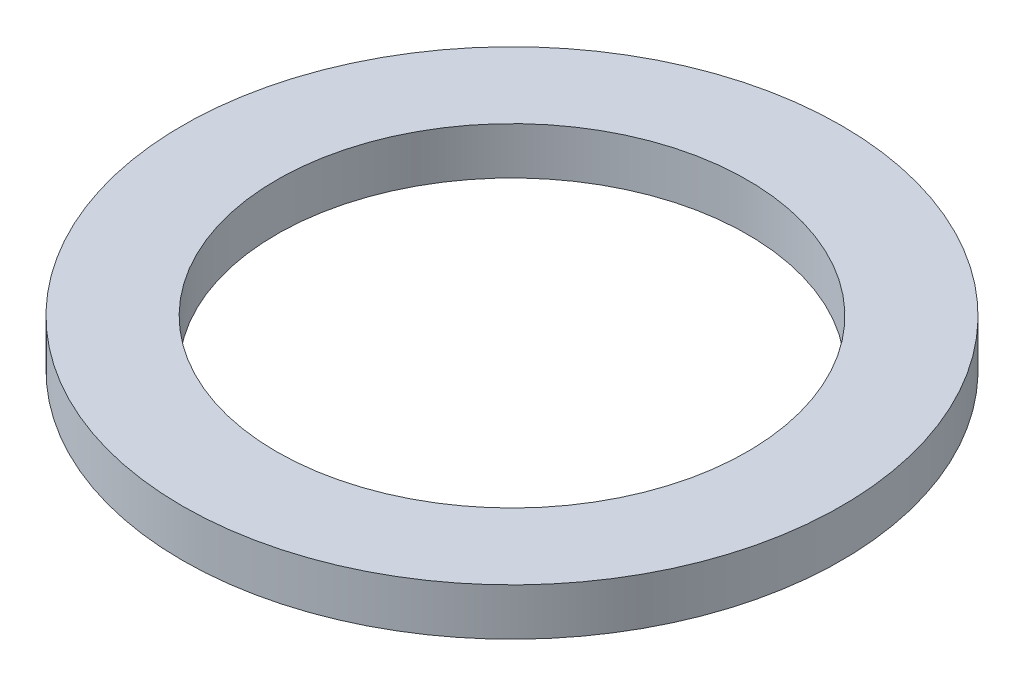
ISO-10303-21;
HEADER;
FILE_DESCRIPTION(('STEP AP214'),'2;1');
FILE_NAME('part.step','',(''),(''),'','','');
FILE_SCHEMA(('AUTOMOTIVE_DESIGN { 1 0 10303 214 1 1 1 1 }'));
ENDSEC;
DATA;
#1=APPLICATION_CONTEXT('core data for automotive mechanical design processes');
#2=APPLICATION_PROTOCOL_DEFINITION('international standard','automotive_design',2000,#1);
#3=PRODUCT_CONTEXT('',#1,'mechanical');
#4=PRODUCT('Part','Part','',(#3));
#5=PRODUCT_RELATED_PRODUCT_CATEGORY('part','',(#4));
#6=PRODUCT_DEFINITION_FORMATION('','',#4);
#7=PRODUCT_DEFINITION_CONTEXT('part definition',#1,'design');
#8=PRODUCT_DEFINITION('design','',#6,#7);
#9=PRODUCT_DEFINITION_SHAPE('','',#8);
#10=(LENGTH_UNIT() NAMED_UNIT(*) SI_UNIT(.MILLI.,.METRE.));
#11=(NAMED_UNIT(*) PLANE_ANGLE_UNIT() SI_UNIT($,.RADIAN.));
#12=(NAMED_UNIT(*) SI_UNIT($,.STERADIAN.) SOLID_ANGLE_UNIT());
#13=UNCERTAINTY_MEASURE_WITH_UNIT(LENGTH_MEASURE(1.E-05),#10,'distance_accuracy_value','');
#14=(GEOMETRIC_REPRESENTATION_CONTEXT(3) GLOBAL_UNCERTAINTY_ASSIGNED_CONTEXT((#13)) GLOBAL_UNIT_ASSIGNED_CONTEXT((#10,
#11,#12)) REPRESENTATION_CONTEXT('',''));
#15=CARTESIAN_POINT('',(0.,0.,0.));
#16=DIRECTION('',(0.,0.,1.));
#17=DIRECTION('',(1.,0.,0.));
#18=AXIS2_PLACEMENT_3D('',#15,#16,#17);
#19=CARTESIAN_POINT('',(0.,0.25,0.));
#20=DIRECTION('',(0.,1.,0.));
#21=DIRECTION('',(0.,0.,1.));
#22=AXIS2_PLACEMENT_3D('',#19,#20,#21);
#23=PLANE('',#22);
#24=CARTESIAN_POINT('',(0.,0.25,0.));
#25=DIRECTION('',(0.,1.,0.));
#26=DIRECTION('',(0.,0.,1.));
#27=AXIS2_PLACEMENT_3D('',#24,#25,#26);
#28=CIRCLE('',#27,3.5);
#29=CARTESIAN_POINT('',(0.,0.25,3.5));
#30=VERTEX_POINT('',#29);
#31=EDGE_CURVE('E10',#30,#30,#28,.T.);
#32=ORIENTED_EDGE('',*,*,#31,.T.);
#33=EDGE_LOOP('',(#32));
#34=FACE_BOUND('',#33,.T.);
#35=CARTESIAN_POINT('',(0.,0.25,0.));
#36=DIRECTION('',(0.,1.,0.));
#37=DIRECTION('',(0.,0.,1.));
#38=AXIS2_PLACEMENT_3D('',#35,#36,#37);
#39=CIRCLE('',#38,2.5);
#40=CARTESIAN_POINT('',(0.,0.25,2.5));
#41=VERTEX_POINT('',#40);
#42=EDGE_CURVE('E50',#41,#41,#39,.T.);
#43=ORIENTED_EDGE('',*,*,#42,.F.);
#44=EDGE_LOOP('',(#43));
#45=FACE_BOUND('',#44,.T.);
#46=ADVANCED_FACE('F39',(#34,#45),#23,.T.);
#47=CARTESIAN_POINT('',(0.,-0.25,0.));
#48=DIRECTION('',(0.,1.,0.));
#49=DIRECTION('',(0.,0.,1.));
#50=AXIS2_PLACEMENT_3D('',#47,#48,#49);
#51=PLANE('',#50);
#52=CARTESIAN_POINT('',(0.,-0.25,0.));
#53=DIRECTION('',(0.,1.,0.));
#54=DIRECTION('',(0.,0.,1.));
#55=AXIS2_PLACEMENT_3D('',#52,#53,#54);
#56=CIRCLE('',#55,3.5);
#57=CARTESIAN_POINT('',(0.,-0.25,3.5));
#58=VERTEX_POINT('',#57);
#59=EDGE_CURVE('E43',#58,#58,#56,.T.);
#60=ORIENTED_EDGE('',*,*,#59,.F.);
#61=EDGE_LOOP('',(#60));
#62=FACE_BOUND('',#61,.T.);
#63=CARTESIAN_POINT('',(0.,-0.25,0.));
#64=DIRECTION('',(0.,1.,0.));
#65=DIRECTION('',(0.,0.,1.));
#66=AXIS2_PLACEMENT_3D('',#63,#64,#65);
#67=CIRCLE('',#66,2.5);
#68=CARTESIAN_POINT('',(0.,-0.25,2.5));
#69=VERTEX_POINT('',#68);
#70=EDGE_CURVE('E52',#69,#69,#67,.T.);
#71=ORIENTED_EDGE('',*,*,#70,.T.);
#72=EDGE_LOOP('',(#71));
#73=FACE_BOUND('',#72,.T.);
#74=ADVANCED_FACE('F62',(#62,#73),#51,.F.);
#75=CARTESIAN_POINT('',(0.,0.25,0.));
#76=DIRECTION('',(0.,-1.,0.));
#77=DIRECTION('',(0.,0.,-1.));
#78=AXIS2_PLACEMENT_3D('',#75,#76,#77);
#79=CYLINDRICAL_SURFACE('',#78,3.5);
#80=ORIENTED_EDGE('',*,*,#31,.F.);
#81=EDGE_LOOP('',(#80));
#82=FACE_BOUND('',#81,.T.);
#83=ORIENTED_EDGE('',*,*,#59,.T.);
#84=EDGE_LOOP('',(#83));
#85=FACE_BOUND('',#84,.T.);
#86=ADVANCED_FACE('F41',(#82,#85),#79,.T.);
#87=CARTESIAN_POINT('',(0.,0.25,0.));
#88=DIRECTION('',(0.,-1.,0.));
#89=DIRECTION('',(0.,0.,-1.));
#90=AXIS2_PLACEMENT_3D('',#87,#88,#89);
#91=CYLINDRICAL_SURFACE('',#90,2.5);
#92=ORIENTED_EDGE('',*,*,#42,.T.);
#93=EDGE_LOOP('',(#92));
#94=FACE_BOUND('',#93,.T.);
#95=ORIENTED_EDGE('',*,*,#70,.F.);
#96=EDGE_LOOP('',(#95));
#97=FACE_BOUND('',#96,.T.);
#98=ADVANCED_FACE('F58',(#94,#97),#91,.F.);
#99=CLOSED_SHELL('',(#46,#74,#86,#98));
#100=MANIFOLD_SOLID_BREP('B2',#99);
#101=ADVANCED_BREP_SHAPE_REPRESENTATION('',(#18,#100),#14);
#102=SHAPE_DEFINITION_REPRESENTATION(#9,#101);
ENDSEC;
END-ISO-10303-21;
